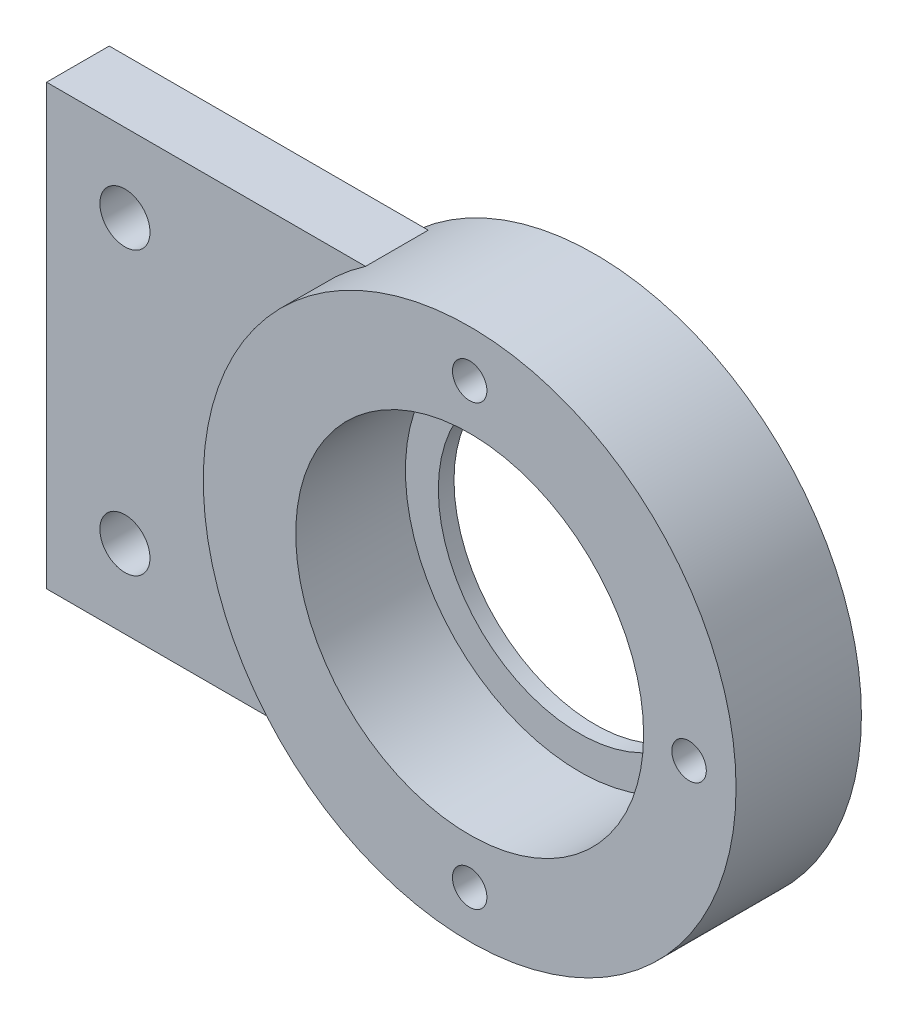
ISO-10303-21;
HEADER;
FILE_DESCRIPTION(('STEP AP214'),'2;1');
FILE_NAME('part.step','',(''),(''),'','','');
FILE_SCHEMA(('AUTOMOTIVE_DESIGN { 1 0 10303 214 1 1 1 1 }'));
ENDSEC;
DATA;
#1=APPLICATION_CONTEXT('core data for automotive mechanical design processes');
#2=APPLICATION_PROTOCOL_DEFINITION('international standard','automotive_design',2000,#1);
#3=PRODUCT_CONTEXT('',#1,'mechanical');
#4=PRODUCT('Part','Part','',(#3));
#5=PRODUCT_RELATED_PRODUCT_CATEGORY('part','',(#4));
#6=PRODUCT_DEFINITION_FORMATION('','',#4);
#7=PRODUCT_DEFINITION_CONTEXT('part definition',#1,'design');
#8=PRODUCT_DEFINITION('design','',#6,#7);
#9=PRODUCT_DEFINITION_SHAPE('','',#8);
#10=(LENGTH_UNIT() NAMED_UNIT(*) SI_UNIT(.MILLI.,.METRE.));
#11=(NAMED_UNIT(*) PLANE_ANGLE_UNIT() SI_UNIT($,.RADIAN.));
#12=(NAMED_UNIT(*) SI_UNIT($,.STERADIAN.) SOLID_ANGLE_UNIT());
#13=UNCERTAINTY_MEASURE_WITH_UNIT(LENGTH_MEASURE(1.E-05),#10,'distance_accuracy_value','');
#14=(GEOMETRIC_REPRESENTATION_CONTEXT(3) GLOBAL_UNCERTAINTY_ASSIGNED_CONTEXT((#13)) GLOBAL_UNIT_ASSIGNED_CONTEXT((#10,
#11,#12)) REPRESENTATION_CONTEXT('',''));
#15=CARTESIAN_POINT('',(0.,0.,0.));
#16=DIRECTION('',(0.,0.,1.));
#17=DIRECTION('',(1.,0.,0.));
#18=AXIS2_PLACEMENT_3D('',#15,#16,#17);
#19=CARTESIAN_POINT('',(0.,0.,0.));
#20=DIRECTION('',(0.,0.,1.));
#21=DIRECTION('',(1.,0.,0.));
#22=AXIS2_PLACEMENT_3D('',#19,#20,#21);
#23=PLANE('',#22);
#24=CARTESIAN_POINT('',(-25.,-9.,0.));
#25=DIRECTION('',(0.,0.,1.));
#26=DIRECTION('',(1.,0.,0.));
#27=AXIS2_PLACEMENT_3D('',#24,#25,#26);
#28=CIRCLE('',#27,1.6);
#29=CARTESIAN_POINT('',(-26.6,-9.,0.));
#30=VERTEX_POINT('',#29);
#31=EDGE_CURVE('E141',#30,#30,#28,.F.);
#32=ORIENTED_EDGE('',*,*,#31,.F.);
#33=EDGE_LOOP('',(#32));
#34=FACE_BOUND('',#33,.T.);
#35=CARTESIAN_POINT('',(-25.,9.,0.));
#36=DIRECTION('',(0.,0.,1.));
#37=DIRECTION('',(1.,0.,0.));
#38=AXIS2_PLACEMENT_3D('',#35,#36,#37);
#39=CIRCLE('',#38,1.6);
#40=CARTESIAN_POINT('',(-26.6,9.,0.));
#41=VERTEX_POINT('',#40);
#42=EDGE_CURVE('E136',#41,#41,#39,.F.);
#43=ORIENTED_EDGE('',*,*,#42,.F.);
#44=EDGE_LOOP('',(#43));
#45=FACE_BOUND('',#44,.T.);
#46=DIRECTION('',(-1.,0.,0.));
#47=VECTOR('',#46,1.);
#48=CARTESIAN_POINT('',(-30.,14.,0.));
#49=LINE('',#48,#47);
#50=CARTESIAN_POINT('',(-9.64365076099296,14.,0.));
#51=VERTEX_POINT('',#50);
#52=CARTESIAN_POINT('',(-30.,14.,0.));
#53=VERTEX_POINT('',#52);
#54=EDGE_CURVE('E89',#51,#53,#49,.T.);
#55=ORIENTED_EDGE('',*,*,#54,.F.);
#56=CARTESIAN_POINT('',(0.,0.,0.));
#57=DIRECTION('',(0.,0.,1.));
#58=DIRECTION('',(1.,0.,0.));
#59=AXIS2_PLACEMENT_3D('',#56,#57,#58);
#60=CIRCLE('',#59,17.);
#61=CARTESIAN_POINT('',(-9.64365076099296,-14.,0.));
#62=VERTEX_POINT('',#61);
#63=EDGE_CURVE('E70',#51,#62,#60,.T.);
#64=ORIENTED_EDGE('',*,*,#63,.T.);
#65=DIRECTION('',(1.,0.,0.));
#66=VECTOR('',#65,1.);
#67=CARTESIAN_POINT('',(-30.,-14.,0.));
#68=LINE('',#67,#66);
#69=CARTESIAN_POINT('',(-30.,-14.,0.));
#70=VERTEX_POINT('',#69);
#71=EDGE_CURVE('E86',#70,#62,#68,.T.);
#72=ORIENTED_EDGE('',*,*,#71,.F.);
#73=DIRECTION('',(0.,-1.,0.));
#74=VECTOR('',#73,1.);
#75=CARTESIAN_POINT('',(-30.,-14.,0.));
#76=LINE('',#75,#74);
#77=EDGE_CURVE('E95',#53,#70,#76,.T.);
#78=ORIENTED_EDGE('',*,*,#77,.F.);
#79=EDGE_LOOP('',(#55,#64,#72,#78));
#80=FACE_BOUND('',#79,.T.);
#81=ADVANCED_FACE('F44',(#34,#45,#80),#23,.F.);
#82=CARTESIAN_POINT('',(0.,0.,7.));
#83=DIRECTION('',(0.,0.,-1.));
#84=DIRECTION('',(-1.,0.,0.));
#85=AXIS2_PLACEMENT_3D('',#82,#83,#84);
#86=CYLINDRICAL_SURFACE('',#85,17.);
#87=CARTESIAN_POINT('',(0.,0.,7.));
#88=DIRECTION('',(0.,0.,1.));
#89=DIRECTION('',(1.,0.,0.));
#90=AXIS2_PLACEMENT_3D('',#87,#88,#89);
#91=CIRCLE('',#90,17.);
#92=CARTESIAN_POINT('',(17.,0.,7.));
#93=VERTEX_POINT('',#92);
#94=EDGE_CURVE('E122',#93,#93,#91,.T.);
#95=ORIENTED_EDGE('',*,*,#94,.F.);
#96=EDGE_LOOP('',(#95));
#97=FACE_BOUND('',#96,.T.);
#98=DIRECTION('',(0.,0.,-1.));
#99=VECTOR('',#98,1.);
#100=CARTESIAN_POINT('',(-9.64365076099296,-14.,7.));
#101=LINE('',#100,#99);
#102=CARTESIAN_POINT('',(-9.64365076099296,-14.,4.));
#103=VERTEX_POINT('',#102);
#104=EDGE_CURVE('E11',#62,#103,#101,.F.);
#105=ORIENTED_EDGE('',*,*,#104,.F.);
#106=ORIENTED_EDGE('',*,*,#63,.F.);
#107=DIRECTION('',(0.,0.,-1.));
#108=VECTOR('',#107,1.);
#109=CARTESIAN_POINT('',(-9.64365076099296,14.,7.));
#110=LINE('',#109,#108);
#111=CARTESIAN_POINT('',(-9.64365076099296,14.,4.));
#112=VERTEX_POINT('',#111);
#113=EDGE_CURVE('E54',#112,#51,#110,.T.);
#114=ORIENTED_EDGE('',*,*,#113,.F.);
#115=CARTESIAN_POINT('',(0.,0.,4.));
#116=DIRECTION('',(0.,0.,-1.));
#117=DIRECTION('',(-1.,0.,0.));
#118=AXIS2_PLACEMENT_3D('',#115,#116,#117);
#119=CIRCLE('',#118,17.);
#120=EDGE_CURVE('E63',#103,#112,#119,.T.);
#121=ORIENTED_EDGE('',*,*,#120,.F.);
#122=EDGE_LOOP('',(#105,#106,#114,#121));
#123=FACE_BOUND('',#122,.T.);
#124=CARTESIAN_POINT('',(0.,0.,-1.));
#125=DIRECTION('',(0.,0.,1.));
#126=DIRECTION('',(1.,0.,0.));
#127=AXIS2_PLACEMENT_3D('',#124,#125,#126);
#128=CIRCLE('',#127,17.);
#129=CARTESIAN_POINT('',(17.,0.,-1.));
#130=VERTEX_POINT('',#129);
#131=EDGE_CURVE('E91',#130,#130,#128,.T.);
#132=ORIENTED_EDGE('',*,*,#131,.T.);
#133=EDGE_LOOP('',(#132));
#134=FACE_BOUND('',#133,.T.);
#135=ADVANCED_FACE('F50',(#97,#123,#134),#86,.T.);
#136=CARTESIAN_POINT('',(0.,0.,7.));
#137=DIRECTION('',(0.,0.,-1.));
#138=DIRECTION('',(-1.,0.,0.));
#139=AXIS2_PLACEMENT_3D('',#136,#137,#138);
#140=CYLINDRICAL_SURFACE('',#139,11.1);
#141=CARTESIAN_POINT('',(0.,0.,0.));
#142=DIRECTION('',(0.,0.,1.));
#143=DIRECTION('',(1.,0.,0.));
#144=AXIS2_PLACEMENT_3D('',#141,#142,#143);
#145=CIRCLE('',#144,11.1);
#146=CARTESIAN_POINT('',(11.1,0.,0.));
#147=VERTEX_POINT('',#146);
#148=EDGE_CURVE('E116',#147,#147,#145,.T.);
#149=ORIENTED_EDGE('',*,*,#148,.F.);
#150=EDGE_LOOP('',(#149));
#151=FACE_BOUND('',#150,.T.);
#152=CARTESIAN_POINT('',(0.,0.,7.));
#153=DIRECTION('',(0.,0.,1.));
#154=DIRECTION('',(1.,0.,0.));
#155=AXIS2_PLACEMENT_3D('',#152,#153,#154);
#156=CIRCLE('',#155,11.1);
#157=CARTESIAN_POINT('',(11.1,0.,7.));
#158=VERTEX_POINT('',#157);
#159=EDGE_CURVE('E123',#158,#158,#156,.T.);
#160=ORIENTED_EDGE('',*,*,#159,.T.);
#161=EDGE_LOOP('',(#160));
#162=FACE_BOUND('',#161,.T.);
#163=ADVANCED_FACE('F219',(#151,#162),#140,.F.);
#164=CARTESIAN_POINT('',(0.,0.,7.));
#165=DIRECTION('',(0.,0.,1.));
#166=DIRECTION('',(1.,0.,0.));
#167=AXIS2_PLACEMENT_3D('',#164,#165,#166);
#168=PLANE('',#167);
#169=CARTESIAN_POINT('',(14.,0.,7.));
#170=DIRECTION('',(0.,0.,1.));
#171=DIRECTION('',(1.,0.,0.));
#172=AXIS2_PLACEMENT_3D('',#169,#170,#171);
#173=CIRCLE('',#172,1.1);
#174=CARTESIAN_POINT('',(12.9,0.,7.));
#175=VERTEX_POINT('',#174);
#176=EDGE_CURVE('E146',#175,#175,#173,.T.);
#177=ORIENTED_EDGE('',*,*,#176,.F.);
#178=EDGE_LOOP('',(#177));
#179=FACE_BOUND('',#178,.T.);
#180=CARTESIAN_POINT('',(0.,-14.,7.));
#181=DIRECTION('',(0.,0.,1.));
#182=DIRECTION('',(1.,0.,0.));
#183=AXIS2_PLACEMENT_3D('',#180,#181,#182);
#184=CIRCLE('',#183,1.1);
#185=CARTESIAN_POINT('',(-1.1,-14.,7.));
#186=VERTEX_POINT('',#185);
#187=EDGE_CURVE('E328',#186,#186,#184,.T.);
#188=ORIENTED_EDGE('',*,*,#187,.F.);
#189=EDGE_LOOP('',(#188));
#190=FACE_BOUND('',#189,.T.);
#191=CARTESIAN_POINT('',(0.,14.,7.));
#192=DIRECTION('',(0.,0.,1.));
#193=DIRECTION('',(1.,0.,0.));
#194=AXIS2_PLACEMENT_3D('',#191,#192,#193);
#195=CIRCLE('',#194,1.1);
#196=CARTESIAN_POINT('',(-1.1,14.,7.));
#197=VERTEX_POINT('',#196);
#198=EDGE_CURVE('E334',#197,#197,#195,.T.);
#199=ORIENTED_EDGE('',*,*,#198,.F.);
#200=EDGE_LOOP('',(#199));
#201=FACE_BOUND('',#200,.T.);
#202=ORIENTED_EDGE('',*,*,#94,.T.);
#203=EDGE_LOOP('',(#202));
#204=FACE_BOUND('',#203,.T.);
#205=ORIENTED_EDGE('',*,*,#159,.F.);
#206=EDGE_LOOP('',(#205));
#207=FACE_BOUND('',#206,.T.);
#208=ADVANCED_FACE('F223',(#179,#190,#201,#204,#207),#168,.T.);
#209=CARTESIAN_POINT('',(-30.,-14.,4.));
#210=DIRECTION('',(0.,1.,0.));
#211=DIRECTION('',(0.,0.,1.));
#212=AXIS2_PLACEMENT_3D('',#209,#210,#211);
#213=PLANE('',#212);
#214=ORIENTED_EDGE('',*,*,#71,.T.);
#215=ORIENTED_EDGE('',*,*,#104,.T.);
#216=DIRECTION('',(1.,0.,0.));
#217=VECTOR('',#216,1.);
#218=CARTESIAN_POINT('',(-30.,-14.,4.));
#219=LINE('',#218,#217);
#220=CARTESIAN_POINT('',(-30.,-14.,4.));
#221=VERTEX_POINT('',#220);
#222=EDGE_CURVE('E186',#221,#103,#219,.T.);
#223=ORIENTED_EDGE('',*,*,#222,.F.);
#224=DIRECTION('',(0.,0.,-1.));
#225=VECTOR('',#224,1.);
#226=CARTESIAN_POINT('',(-30.,-14.,4.));
#227=LINE('',#226,#225);
#228=EDGE_CURVE('E99',#221,#70,#227,.T.);
#229=ORIENTED_EDGE('',*,*,#228,.T.);
#230=EDGE_LOOP('',(#214,#215,#223,#229));
#231=FACE_BOUND('',#230,.T.);
#232=ADVANCED_FACE('F98',(#231),#213,.F.);
#233=CARTESIAN_POINT('',(-30.,14.,4.));
#234=DIRECTION('',(0.,-1.,0.));
#235=DIRECTION('',(0.,0.,-1.));
#236=AXIS2_PLACEMENT_3D('',#233,#234,#235);
#237=PLANE('',#236);
#238=DIRECTION('',(-1.,0.,0.));
#239=VECTOR('',#238,1.);
#240=CARTESIAN_POINT('',(-30.,14.,4.));
#241=LINE('',#240,#239);
#242=CARTESIAN_POINT('',(-30.,14.,4.));
#243=VERTEX_POINT('',#242);
#244=EDGE_CURVE('E113',#112,#243,#241,.T.);
#245=ORIENTED_EDGE('',*,*,#244,.F.);
#246=ORIENTED_EDGE('',*,*,#113,.T.);
#247=ORIENTED_EDGE('',*,*,#54,.T.);
#248=DIRECTION('',(0.,0.,-1.));
#249=VECTOR('',#248,1.);
#250=CARTESIAN_POINT('',(-30.,14.,4.));
#251=LINE('',#250,#249);
#252=EDGE_CURVE('E112',#243,#53,#251,.T.);
#253=ORIENTED_EDGE('',*,*,#252,.F.);
#254=EDGE_LOOP('',(#245,#246,#247,#253));
#255=FACE_BOUND('',#254,.T.);
#256=ADVANCED_FACE('F200',(#255),#237,.F.);
#257=CARTESIAN_POINT('',(-30.,-14.,4.));
#258=DIRECTION('',(1.,0.,0.));
#259=DIRECTION('',(0.,0.,-1.));
#260=AXIS2_PLACEMENT_3D('',#257,#258,#259);
#261=PLANE('',#260);
#262=ORIENTED_EDGE('',*,*,#77,.T.);
#263=ORIENTED_EDGE('',*,*,#228,.F.);
#264=DIRECTION('',(0.,-1.,0.));
#265=VECTOR('',#264,1.);
#266=CARTESIAN_POINT('',(-30.,-14.,4.));
#267=LINE('',#266,#265);
#268=EDGE_CURVE('E106',#243,#221,#267,.T.);
#269=ORIENTED_EDGE('',*,*,#268,.F.);
#270=ORIENTED_EDGE('',*,*,#252,.T.);
#271=EDGE_LOOP('',(#262,#263,#269,#270));
#272=FACE_BOUND('',#271,.T.);
#273=ADVANCED_FACE('F203',(#272),#261,.F.);
#274=CARTESIAN_POINT('',(0.,0.,4.));
#275=DIRECTION('',(0.,0.,-1.));
#276=DIRECTION('',(-1.,0.,0.));
#277=AXIS2_PLACEMENT_3D('',#274,#275,#276);
#278=PLANE('',#277);
#279=CARTESIAN_POINT('',(-25.,-9.,4.));
#280=DIRECTION('',(0.,0.,-1.));
#281=DIRECTION('',(-1.,0.,0.));
#282=AXIS2_PLACEMENT_3D('',#279,#280,#281);
#283=CIRCLE('',#282,1.6);
#284=CARTESIAN_POINT('',(-26.6,-9.,4.));
#285=VERTEX_POINT('',#284);
#286=EDGE_CURVE('E139',#285,#285,#283,.F.);
#287=ORIENTED_EDGE('',*,*,#286,.F.);
#288=EDGE_LOOP('',(#287));
#289=FACE_BOUND('',#288,.T.);
#290=CARTESIAN_POINT('',(-25.,9.,4.));
#291=DIRECTION('',(0.,0.,-1.));
#292=DIRECTION('',(-1.,0.,0.));
#293=AXIS2_PLACEMENT_3D('',#290,#291,#292);
#294=CIRCLE('',#293,1.6);
#295=CARTESIAN_POINT('',(-26.6,9.,4.));
#296=VERTEX_POINT('',#295);
#297=EDGE_CURVE('E134',#296,#296,#294,.F.);
#298=ORIENTED_EDGE('',*,*,#297,.F.);
#299=EDGE_LOOP('',(#298));
#300=FACE_BOUND('',#299,.T.);
#301=ORIENTED_EDGE('',*,*,#222,.T.);
#302=ORIENTED_EDGE('',*,*,#120,.T.);
#303=ORIENTED_EDGE('',*,*,#244,.T.);
#304=ORIENTED_EDGE('',*,*,#268,.T.);
#305=EDGE_LOOP('',(#301,#302,#303,#304));
#306=FACE_BOUND('',#305,.T.);
#307=ADVANCED_FACE('F198',(#289,#300,#306),#278,.F.);
#308=CARTESIAN_POINT('',(0.,0.,0.));
#309=DIRECTION('',(0.,0.,1.));
#310=DIRECTION('',(1.,0.,0.));
#311=AXIS2_PLACEMENT_3D('',#308,#309,#310);
#312=PLANE('',#311);
#313=ORIENTED_EDGE('',*,*,#148,.T.);
#314=EDGE_LOOP('',(#313));
#315=FACE_BOUND('',#314,.T.);
#316=CARTESIAN_POINT('',(0.,0.,0.));
#317=DIRECTION('',(0.,0.,1.));
#318=DIRECTION('',(1.,0.,0.));
#319=AXIS2_PLACEMENT_3D('',#316,#317,#318);
#320=CIRCLE('',#319,9.);
#321=CARTESIAN_POINT('',(9.,0.,0.));
#322=VERTEX_POINT('',#321);
#323=EDGE_CURVE('E178',#322,#322,#320,.T.);
#324=ORIENTED_EDGE('',*,*,#323,.F.);
#325=EDGE_LOOP('',(#324));
#326=FACE_BOUND('',#325,.T.);
#327=ADVANCED_FACE('F162',(#315,#326),#312,.T.);
#328=CARTESIAN_POINT('',(0.,0.,-1.));
#329=DIRECTION('',(0.,0.,1.));
#330=DIRECTION('',(1.,0.,0.));
#331=AXIS2_PLACEMENT_3D('',#328,#329,#330);
#332=PLANE('',#331);
#333=CARTESIAN_POINT('',(14.,0.,-1.));
#334=DIRECTION('',(0.,0.,1.));
#335=DIRECTION('',(1.,0.,0.));
#336=AXIS2_PLACEMENT_3D('',#333,#334,#335);
#337=CIRCLE('',#336,1.1);
#338=CARTESIAN_POINT('',(12.9,0.,-1.));
#339=VERTEX_POINT('',#338);
#340=EDGE_CURVE('E47',#339,#339,#337,.F.);
#341=ORIENTED_EDGE('',*,*,#340,.F.);
#342=EDGE_LOOP('',(#341));
#343=FACE_BOUND('',#342,.T.);
#344=CARTESIAN_POINT('',(0.,-14.,-1.));
#345=DIRECTION('',(0.,0.,1.));
#346=DIRECTION('',(1.,0.,0.));
#347=AXIS2_PLACEMENT_3D('',#344,#345,#346);
#348=CIRCLE('',#347,1.1);
#349=CARTESIAN_POINT('',(-1.1,-14.,-1.));
#350=VERTEX_POINT('',#349);
#351=EDGE_CURVE('E150',#350,#350,#348,.F.);
#352=ORIENTED_EDGE('',*,*,#351,.F.);
#353=EDGE_LOOP('',(#352));
#354=FACE_BOUND('',#353,.T.);
#355=CARTESIAN_POINT('',(0.,14.,-1.));
#356=DIRECTION('',(0.,0.,1.));
#357=DIRECTION('',(1.,0.,0.));
#358=AXIS2_PLACEMENT_3D('',#355,#356,#357);
#359=CIRCLE('',#358,1.1);
#360=CARTESIAN_POINT('',(-1.1,14.,-1.));
#361=VERTEX_POINT('',#360);
#362=EDGE_CURVE('E145',#361,#361,#359,.F.);
#363=ORIENTED_EDGE('',*,*,#362,.F.);
#364=EDGE_LOOP('',(#363));
#365=FACE_BOUND('',#364,.T.);
#366=ORIENTED_EDGE('',*,*,#131,.F.);
#367=EDGE_LOOP('',(#366));
#368=FACE_BOUND('',#367,.T.);
#369=CARTESIAN_POINT('',(0.,0.,-1.));
#370=DIRECTION('',(0.,0.,1.));
#371=DIRECTION('',(1.,0.,0.));
#372=AXIS2_PLACEMENT_3D('',#369,#370,#371);
#373=CIRCLE('',#372,9.);
#374=CARTESIAN_POINT('',(9.,0.,-1.));
#375=VERTEX_POINT('',#374);
#376=EDGE_CURVE('E173',#375,#375,#373,.T.);
#377=ORIENTED_EDGE('',*,*,#376,.T.);
#378=EDGE_LOOP('',(#377));
#379=FACE_BOUND('',#378,.T.);
#380=ADVANCED_FACE('F157',(#343,#354,#365,#368,#379),#332,.F.);
#381=CARTESIAN_POINT('',(0.,0.,0.));
#382=DIRECTION('',(0.,0.,-1.));
#383=DIRECTION('',(-1.,0.,0.));
#384=AXIS2_PLACEMENT_3D('',#381,#382,#383);
#385=CYLINDRICAL_SURFACE('',#384,9.);
#386=ORIENTED_EDGE('',*,*,#323,.T.);
#387=EDGE_LOOP('',(#386));
#388=FACE_BOUND('',#387,.T.);
#389=ORIENTED_EDGE('',*,*,#376,.F.);
#390=EDGE_LOOP('',(#389));
#391=FACE_BOUND('',#390,.T.);
#392=ADVANCED_FACE('F165',(#388,#391),#385,.F.);
#393=CARTESIAN_POINT('',(-25.,9.,7.));
#394=DIRECTION('',(0.,0.,-1.));
#395=DIRECTION('',(-1.,0.,0.));
#396=AXIS2_PLACEMENT_3D('',#393,#394,#395);
#397=CYLINDRICAL_SURFACE('',#396,1.6);
#398=CARTESIAN_POINT('',(-26.6,9.,4.));
#399=CARTESIAN_POINT('',(-26.6,9.,3.95833333333333));
#400=CARTESIAN_POINT('',(-26.6,9.,3.91666666666667));
#401=CARTESIAN_POINT('',(-26.6,9.,3.83333333333333));
#402=CARTESIAN_POINT('',(-26.6,9.,3.79166666666667));
#403=CARTESIAN_POINT('',(-26.6,9.,3.70833333333333));
#404=CARTESIAN_POINT('',(-26.6,9.,3.66666666666667));
#405=CARTESIAN_POINT('',(-26.6,9.,3.58333333333333));
#406=CARTESIAN_POINT('',(-26.6,9.,3.54166666666667));
#407=CARTESIAN_POINT('',(-26.6,9.,3.45833333333333));
#408=CARTESIAN_POINT('',(-26.6,9.,3.41666666666667));
#409=CARTESIAN_POINT('',(-26.6,9.,3.33333333333333));
#410=CARTESIAN_POINT('',(-26.6,9.,3.29166666666667));
#411=CARTESIAN_POINT('',(-26.6,9.,3.20833333333333));
#412=CARTESIAN_POINT('',(-26.6,9.,3.16666666666667));
#413=CARTESIAN_POINT('',(-26.6,9.,3.08333333333333));
#414=CARTESIAN_POINT('',(-26.6,9.,3.04166666666667));
#415=CARTESIAN_POINT('',(-26.6,9.,2.95833333333333));
#416=CARTESIAN_POINT('',(-26.6,9.,2.91666666666667));
#417=CARTESIAN_POINT('',(-26.6,9.,2.83333333333333));
#418=CARTESIAN_POINT('',(-26.6,9.,2.79166666666667));
#419=CARTESIAN_POINT('',(-26.6,9.,2.70833333333333));
#420=CARTESIAN_POINT('',(-26.6,9.,2.66666666666667));
#421=CARTESIAN_POINT('',(-26.6,9.,2.58333333333333));
#422=CARTESIAN_POINT('',(-26.6,9.,2.54166666666667));
#423=CARTESIAN_POINT('',(-26.6,9.,2.45833333333333));
#424=CARTESIAN_POINT('',(-26.6,9.,2.41666666666667));
#425=CARTESIAN_POINT('',(-26.6,9.,2.33333333333333));
#426=CARTESIAN_POINT('',(-26.6,9.,2.29166666666667));
#427=CARTESIAN_POINT('',(-26.6,9.,2.20833333333333));
#428=CARTESIAN_POINT('',(-26.6,9.,2.16666666666667));
#429=CARTESIAN_POINT('',(-26.6,9.,2.08333333333333));
#430=CARTESIAN_POINT('',(-26.6,9.,2.04166666666667));
#431=CARTESIAN_POINT('',(-26.6,9.,1.95833333333333));
#432=CARTESIAN_POINT('',(-26.6,9.,1.91666666666667));
#433=CARTESIAN_POINT('',(-26.6,9.,1.83333333333333));
#434=CARTESIAN_POINT('',(-26.6,9.,1.79166666666667));
#435=CARTESIAN_POINT('',(-26.6,9.,1.70833333333333));
#436=CARTESIAN_POINT('',(-26.6,9.,1.66666666666667));
#437=CARTESIAN_POINT('',(-26.6,9.,1.58333333333333));
#438=CARTESIAN_POINT('',(-26.6,9.,1.54166666666667));
#439=CARTESIAN_POINT('',(-26.6,9.,1.45833333333333));
#440=CARTESIAN_POINT('',(-26.6,9.,1.41666666666667));
#441=CARTESIAN_POINT('',(-26.6,9.,1.33333333333333));
#442=CARTESIAN_POINT('',(-26.6,9.,1.29166666666667));
#443=CARTESIAN_POINT('',(-26.6,9.,1.20833333333333));
#444=CARTESIAN_POINT('',(-26.6,9.,1.16666666666667));
#445=CARTESIAN_POINT('',(-26.6,9.,1.08333333333333));
#446=CARTESIAN_POINT('',(-26.6,9.,1.04166666666667));
#447=CARTESIAN_POINT('',(-26.6,9.,0.958333333333333));
#448=CARTESIAN_POINT('',(-26.6,9.,0.916666666666667));
#449=CARTESIAN_POINT('',(-26.6,9.,0.833333333333333));
#450=CARTESIAN_POINT('',(-26.6,9.,0.791666666666667));
#451=CARTESIAN_POINT('',(-26.6,9.,0.708333333333333));
#452=CARTESIAN_POINT('',(-26.6,9.,0.666666666666666));
#453=CARTESIAN_POINT('',(-26.6,9.,0.583333333333333));
#454=CARTESIAN_POINT('',(-26.6,9.,0.541666666666666));
#455=CARTESIAN_POINT('',(-26.6,9.,0.458333333333333));
#456=CARTESIAN_POINT('',(-26.6,9.,0.416666666666666));
#457=CARTESIAN_POINT('',(-26.6,9.,0.333333333333333));
#458=CARTESIAN_POINT('',(-26.6,9.,0.291666666666666));
#459=CARTESIAN_POINT('',(-26.6,9.,0.208333333333333));
#460=CARTESIAN_POINT('',(-26.6,9.,0.166666666666666));
#461=CARTESIAN_POINT('',(-26.6,9.,0.0833333333333325));
#462=CARTESIAN_POINT('',(-26.6,9.,0.0416666666666658));
#463=CARTESIAN_POINT('',(-26.6,9.,0.));
#464=B_SPLINE_CURVE_WITH_KNOTS('',3,(#398,#399,#400,#401,#402,#403,#404,#405,#406,#407,#408,
#409,#410,#411,#412,#413,#414,#415,#416,#417,#418,#419,#420,#421,#422,#423,#424,#425,#426,#427,
#428,#429,#430,#431,#432,#433,#434,#435,#436,#437,#438,#439,#440,#441,#442,#443,#444,#445,#446,
#447,#448,#449,#450,#451,#452,#453,#454,#455,#456,#457,#458,#459,#460,#461,#462,#463),
.UNSPECIFIED.,.F.,.F.,(4,2,2,2,2,2,2,2,2,2,2,2,2,2,2,2,2,2,2,2,2,2,2,2,2,2,2,2,2,2,2,2,4),(0.,
0.125,0.25,0.375,0.5,0.625,0.75,0.875,1.,1.125,1.25,1.375,1.5,1.625,1.75,1.875,2.,2.125,2.25,
2.375,2.5,2.625,2.75,2.875,3.,3.125,3.25,3.375,3.5,3.625,3.75,3.875,4.),.UNSPECIFIED.);
#465=EDGE_CURVE('BSEAM242',#296,#41,#464,.T.);
#466=ORIENTED_EDGE('',*,*,#297,.T.);
#467=ORIENTED_EDGE('',*,*,#42,.T.);
#468=ORIENTED_EDGE('',*,*,#465,.T.);
#469=ORIENTED_EDGE('',*,*,#465,.F.);
#470=EDGE_LOOP('',(#466,#468,#467,#469));
#471=FACE_BOUND('',#470,.T.);
#472=ADVANCED_FACE('F242',(#471),#397,.F.);
#473=CARTESIAN_POINT('',(-25.,-9.,7.));
#474=DIRECTION('',(0.,0.,-1.));
#475=DIRECTION('',(-1.,0.,0.));
#476=AXIS2_PLACEMENT_3D('',#473,#474,#475);
#477=CYLINDRICAL_SURFACE('',#476,1.6);
#478=CARTESIAN_POINT('',(-26.6,-9.,4.));
#479=CARTESIAN_POINT('',(-26.6,-9.,3.95833333333333));
#480=CARTESIAN_POINT('',(-26.6,-9.,3.91666666666667));
#481=CARTESIAN_POINT('',(-26.6,-9.,3.83333333333333));
#482=CARTESIAN_POINT('',(-26.6,-9.,3.79166666666667));
#483=CARTESIAN_POINT('',(-26.6,-9.,3.70833333333333));
#484=CARTESIAN_POINT('',(-26.6,-9.,3.66666666666667));
#485=CARTESIAN_POINT('',(-26.6,-9.,3.58333333333333));
#486=CARTESIAN_POINT('',(-26.6,-9.,3.54166666666667));
#487=CARTESIAN_POINT('',(-26.6,-9.,3.45833333333333));
#488=CARTESIAN_POINT('',(-26.6,-9.,3.41666666666667));
#489=CARTESIAN_POINT('',(-26.6,-9.,3.33333333333333));
#490=CARTESIAN_POINT('',(-26.6,-9.,3.29166666666667));
#491=CARTESIAN_POINT('',(-26.6,-9.,3.20833333333333));
#492=CARTESIAN_POINT('',(-26.6,-9.,3.16666666666667));
#493=CARTESIAN_POINT('',(-26.6,-9.,3.08333333333333));
#494=CARTESIAN_POINT('',(-26.6,-9.,3.04166666666667));
#495=CARTESIAN_POINT('',(-26.6,-9.,2.95833333333333));
#496=CARTESIAN_POINT('',(-26.6,-9.,2.91666666666667));
#497=CARTESIAN_POINT('',(-26.6,-9.,2.83333333333333));
#498=CARTESIAN_POINT('',(-26.6,-9.,2.79166666666667));
#499=CARTESIAN_POINT('',(-26.6,-9.,2.70833333333333));
#500=CARTESIAN_POINT('',(-26.6,-9.,2.66666666666667));
#501=CARTESIAN_POINT('',(-26.6,-9.,2.58333333333333));
#502=CARTESIAN_POINT('',(-26.6,-9.,2.54166666666667));
#503=CARTESIAN_POINT('',(-26.6,-9.,2.45833333333333));
#504=CARTESIAN_POINT('',(-26.6,-9.,2.41666666666667));
#505=CARTESIAN_POINT('',(-26.6,-9.,2.33333333333333));
#506=CARTESIAN_POINT('',(-26.6,-9.,2.29166666666667));
#507=CARTESIAN_POINT('',(-26.6,-9.,2.20833333333333));
#508=CARTESIAN_POINT('',(-26.6,-9.,2.16666666666667));
#509=CARTESIAN_POINT('',(-26.6,-9.,2.08333333333333));
#510=CARTESIAN_POINT('',(-26.6,-9.,2.04166666666667));
#511=CARTESIAN_POINT('',(-26.6,-9.,1.95833333333333));
#512=CARTESIAN_POINT('',(-26.6,-9.,1.91666666666667));
#513=CARTESIAN_POINT('',(-26.6,-9.,1.83333333333333));
#514=CARTESIAN_POINT('',(-26.6,-9.,1.79166666666667));
#515=CARTESIAN_POINT('',(-26.6,-9.,1.70833333333333));
#516=CARTESIAN_POINT('',(-26.6,-9.,1.66666666666667));
#517=CARTESIAN_POINT('',(-26.6,-9.,1.58333333333333));
#518=CARTESIAN_POINT('',(-26.6,-9.,1.54166666666667));
#519=CARTESIAN_POINT('',(-26.6,-9.,1.45833333333333));
#520=CARTESIAN_POINT('',(-26.6,-9.,1.41666666666667));
#521=CARTESIAN_POINT('',(-26.6,-9.,1.33333333333333));
#522=CARTESIAN_POINT('',(-26.6,-9.,1.29166666666667));
#523=CARTESIAN_POINT('',(-26.6,-9.,1.20833333333333));
#524=CARTESIAN_POINT('',(-26.6,-9.,1.16666666666667));
#525=CARTESIAN_POINT('',(-26.6,-9.,1.08333333333333));
#526=CARTESIAN_POINT('',(-26.6,-9.,1.04166666666667));
#527=CARTESIAN_POINT('',(-26.6,-9.,0.958333333333333));
#528=CARTESIAN_POINT('',(-26.6,-9.,0.916666666666667));
#529=CARTESIAN_POINT('',(-26.6,-9.,0.833333333333333));
#530=CARTESIAN_POINT('',(-26.6,-9.,0.791666666666667));
#531=CARTESIAN_POINT('',(-26.6,-9.,0.708333333333333));
#532=CARTESIAN_POINT('',(-26.6,-9.,0.666666666666666));
#533=CARTESIAN_POINT('',(-26.6,-9.,0.583333333333333));
#534=CARTESIAN_POINT('',(-26.6,-9.,0.541666666666666));
#535=CARTESIAN_POINT('',(-26.6,-9.,0.458333333333333));
#536=CARTESIAN_POINT('',(-26.6,-9.,0.416666666666666));
#537=CARTESIAN_POINT('',(-26.6,-9.,0.333333333333333));
#538=CARTESIAN_POINT('',(-26.6,-9.,0.291666666666666));
#539=CARTESIAN_POINT('',(-26.6,-9.,0.208333333333333));
#540=CARTESIAN_POINT('',(-26.6,-9.,0.166666666666666));
#541=CARTESIAN_POINT('',(-26.6,-9.,0.0833333333333325));
#542=CARTESIAN_POINT('',(-26.6,-9.,0.0416666666666658));
#543=CARTESIAN_POINT('',(-26.6,-9.,0.));
#544=B_SPLINE_CURVE_WITH_KNOTS('',3,(#478,#479,#480,#481,#482,#483,#484,#485,#486,#487,#488,
#489,#490,#491,#492,#493,#494,#495,#496,#497,#498,#499,#500,#501,#502,#503,#504,#505,#506,#507,
#508,#509,#510,#511,#512,#513,#514,#515,#516,#517,#518,#519,#520,#521,#522,#523,#524,#525,#526,
#527,#528,#529,#530,#531,#532,#533,#534,#535,#536,#537,#538,#539,#540,#541,#542,#543),
.UNSPECIFIED.,.F.,.F.,(4,2,2,2,2,2,2,2,2,2,2,2,2,2,2,2,2,2,2,2,2,2,2,2,2,2,2,2,2,2,2,2,4),(0.,
0.125,0.25,0.375,0.5,0.625,0.75,0.875,1.,1.125,1.25,1.375,1.5,1.625,1.75,1.875,2.,2.125,2.25,
2.375,2.5,2.625,2.75,2.875,3.,3.125,3.25,3.375,3.5,3.625,3.75,3.875,4.),.UNSPECIFIED.);
#545=EDGE_CURVE('BSEAM248',#285,#30,#544,.T.);
#546=ORIENTED_EDGE('',*,*,#286,.T.);
#547=ORIENTED_EDGE('',*,*,#31,.T.);
#548=ORIENTED_EDGE('',*,*,#545,.T.);
#549=ORIENTED_EDGE('',*,*,#545,.F.);
#550=EDGE_LOOP('',(#546,#548,#547,#549));
#551=FACE_BOUND('',#550,.T.);
#552=ADVANCED_FACE('F248',(#551),#477,.F.);
#553=CARTESIAN_POINT('',(0.,14.,7.));
#554=DIRECTION('',(0.,0.,-1.));
#555=DIRECTION('',(-1.,0.,0.));
#556=AXIS2_PLACEMENT_3D('',#553,#554,#555);
#557=CYLINDRICAL_SURFACE('',#556,1.1);
#558=CARTESIAN_POINT('',(-1.1,14.,7.));
#559=CARTESIAN_POINT('',(-1.1,14.,6.91666666666667));
#560=CARTESIAN_POINT('',(-1.1,14.,6.83333333333333));
#561=CARTESIAN_POINT('',(-1.1,14.,6.66666666666667));
#562=CARTESIAN_POINT('',(-1.1,14.,6.58333333333333));
#563=CARTESIAN_POINT('',(-1.1,14.,6.41666666666667));
#564=CARTESIAN_POINT('',(-1.1,14.,6.33333333333333));
#565=CARTESIAN_POINT('',(-1.1,14.,6.16666666666667));
#566=CARTESIAN_POINT('',(-1.1,14.,6.08333333333333));
#567=CARTESIAN_POINT('',(-1.1,14.,5.91666666666666));
#568=CARTESIAN_POINT('',(-1.1,14.,5.83333333333333));
#569=CARTESIAN_POINT('',(-1.1,14.,5.66666666666666));
#570=CARTESIAN_POINT('',(-1.1,14.,5.58333333333333));
#571=CARTESIAN_POINT('',(-1.1,14.,5.41666666666667));
#572=CARTESIAN_POINT('',(-1.1,14.,5.33333333333333));
#573=CARTESIAN_POINT('',(-1.1,14.,5.16666666666667));
#574=CARTESIAN_POINT('',(-1.1,14.,5.08333333333333));
#575=CARTESIAN_POINT('',(-1.1,14.,4.91666666666666));
#576=CARTESIAN_POINT('',(-1.1,14.,4.83333333333333));
#577=CARTESIAN_POINT('',(-1.1,14.,4.66666666666666));
#578=CARTESIAN_POINT('',(-1.1,14.,4.58333333333333));
#579=CARTESIAN_POINT('',(-1.1,14.,4.41666666666667));
#580=CARTESIAN_POINT('',(-1.1,14.,4.33333333333333));
#581=CARTESIAN_POINT('',(-1.1,14.,4.16666666666667));
#582=CARTESIAN_POINT('',(-1.1,14.,4.08333333333333));
#583=CARTESIAN_POINT('',(-1.1,14.,3.91666666666666));
#584=CARTESIAN_POINT('',(-1.1,14.,3.83333333333333));
#585=CARTESIAN_POINT('',(-1.1,14.,3.66666666666666));
#586=CARTESIAN_POINT('',(-1.1,14.,3.58333333333333));
#587=CARTESIAN_POINT('',(-1.1,14.,3.41666666666666));
#588=CARTESIAN_POINT('',(-1.1,14.,3.33333333333333));
#589=CARTESIAN_POINT('',(-1.1,14.,3.16666666666666));
#590=CARTESIAN_POINT('',(-1.1,14.,3.08333333333333));
#591=CARTESIAN_POINT('',(-1.1,14.,2.91666666666667));
#592=CARTESIAN_POINT('',(-1.1,14.,2.83333333333333));
#593=CARTESIAN_POINT('',(-1.1,14.,2.66666666666666));
#594=CARTESIAN_POINT('',(-1.1,14.,2.58333333333333));
#595=CARTESIAN_POINT('',(-1.1,14.,2.41666666666666));
#596=CARTESIAN_POINT('',(-1.1,14.,2.33333333333333));
#597=CARTESIAN_POINT('',(-1.1,14.,2.16666666666666));
#598=CARTESIAN_POINT('',(-1.1,14.,2.08333333333333));
#599=CARTESIAN_POINT('',(-1.1,14.,1.91666666666666));
#600=CARTESIAN_POINT('',(-1.1,14.,1.83333333333333));
#601=CARTESIAN_POINT('',(-1.1,14.,1.66666666666666));
#602=CARTESIAN_POINT('',(-1.1,14.,1.58333333333333));
#603=CARTESIAN_POINT('',(-1.1,14.,1.41666666666666));
#604=CARTESIAN_POINT('',(-1.1,14.,1.33333333333333));
#605=CARTESIAN_POINT('',(-1.1,14.,1.16666666666666));
#606=CARTESIAN_POINT('',(-1.1,14.,1.08333333333333));
#607=CARTESIAN_POINT('',(-1.1,14.,0.916666666666664));
#608=CARTESIAN_POINT('',(-1.1,14.,0.833333333333331));
#609=CARTESIAN_POINT('',(-1.1,14.,0.666666666666664));
#610=CARTESIAN_POINT('',(-1.1,14.,0.58333333333333));
#611=CARTESIAN_POINT('',(-1.1,14.,0.416666666666664));
#612=CARTESIAN_POINT('',(-1.1,14.,0.33333333333333));
#613=CARTESIAN_POINT('',(-1.1,14.,0.166666666666664));
#614=CARTESIAN_POINT('',(-1.1,14.,0.0833333333333305));
#615=CARTESIAN_POINT('',(-1.1,14.,-0.083333333333336));
#616=CARTESIAN_POINT('',(-1.1,14.,-0.166666666666669));
#617=CARTESIAN_POINT('',(-1.1,14.,-0.333333333333336));
#618=CARTESIAN_POINT('',(-1.1,14.,-0.41666666666667));
#619=CARTESIAN_POINT('',(-1.1,14.,-0.583333333333336));
#620=CARTESIAN_POINT('',(-1.1,14.,-0.66666666666667));
#621=CARTESIAN_POINT('',(-1.1,14.,-0.833333333333336));
#622=CARTESIAN_POINT('',(-1.1,14.,-0.91666666666667));
#623=CARTESIAN_POINT('',(-1.1,14.,-1.));
#624=B_SPLINE_CURVE_WITH_KNOTS('',3,(#558,#559,#560,#561,#562,#563,#564,#565,#566,#567,#568,
#569,#570,#571,#572,#573,#574,#575,#576,#577,#578,#579,#580,#581,#582,#583,#584,#585,#586,#587,
#588,#589,#590,#591,#592,#593,#594,#595,#596,#597,#598,#599,#600,#601,#602,#603,#604,#605,#606,
#607,#608,#609,#610,#611,#612,#613,#614,#615,#616,#617,#618,#619,#620,#621,#622,#623),
.UNSPECIFIED.,.F.,.F.,(4,2,2,2,2,2,2,2,2,2,2,2,2,2,2,2,2,2,2,2,2,2,2,2,2,2,2,2,2,2,2,2,4),(0.,
0.25,0.5,0.750000000000001,1.,1.25,1.5,1.75,2.,2.25,2.5,2.75,3.,3.25,3.5,3.75,4.,4.25,4.5,4.75,
5.,5.25,5.5,5.75,6.,6.25,6.5,6.75,7.,7.25,7.5,7.75,8.),.UNSPECIFIED.);
#625=EDGE_CURVE('BSEAM297',#197,#361,#624,.T.);
#626=ORIENTED_EDGE('',*,*,#198,.T.);
#627=ORIENTED_EDGE('',*,*,#362,.T.);
#628=ORIENTED_EDGE('',*,*,#625,.T.);
#629=ORIENTED_EDGE('',*,*,#625,.F.);
#630=EDGE_LOOP('',(#626,#628,#627,#629));
#631=FACE_BOUND('',#630,.T.);
#632=ADVANCED_FACE('F297',(#631),#557,.F.);
#633=CARTESIAN_POINT('',(0.,-14.,7.));
#634=DIRECTION('',(0.,0.,-1.));
#635=DIRECTION('',(-1.,0.,0.));
#636=AXIS2_PLACEMENT_3D('',#633,#634,#635);
#637=CYLINDRICAL_SURFACE('',#636,1.1);
#638=CARTESIAN_POINT('',(-1.1,-14.,7.));
#639=CARTESIAN_POINT('',(-1.1,-14.,6.91666666666667));
#640=CARTESIAN_POINT('',(-1.1,-14.,6.83333333333333));
#641=CARTESIAN_POINT('',(-1.1,-14.,6.66666666666667));
#642=CARTESIAN_POINT('',(-1.1,-14.,6.58333333333333));
#643=CARTESIAN_POINT('',(-1.1,-14.,6.41666666666667));
#644=CARTESIAN_POINT('',(-1.1,-14.,6.33333333333333));
#645=CARTESIAN_POINT('',(-1.1,-14.,6.16666666666667));
#646=CARTESIAN_POINT('',(-1.1,-14.,6.08333333333333));
#647=CARTESIAN_POINT('',(-1.1,-14.,5.91666666666666));
#648=CARTESIAN_POINT('',(-1.1,-14.,5.83333333333333));
#649=CARTESIAN_POINT('',(-1.1,-14.,5.66666666666666));
#650=CARTESIAN_POINT('',(-1.1,-14.,5.58333333333333));
#651=CARTESIAN_POINT('',(-1.1,-14.,5.41666666666667));
#652=CARTESIAN_POINT('',(-1.1,-14.,5.33333333333333));
#653=CARTESIAN_POINT('',(-1.1,-14.,5.16666666666667));
#654=CARTESIAN_POINT('',(-1.1,-14.,5.08333333333333));
#655=CARTESIAN_POINT('',(-1.1,-14.,4.91666666666666));
#656=CARTESIAN_POINT('',(-1.1,-14.,4.83333333333333));
#657=CARTESIAN_POINT('',(-1.1,-14.,4.66666666666666));
#658=CARTESIAN_POINT('',(-1.1,-14.,4.58333333333333));
#659=CARTESIAN_POINT('',(-1.1,-14.,4.41666666666667));
#660=CARTESIAN_POINT('',(-1.1,-14.,4.33333333333333));
#661=CARTESIAN_POINT('',(-1.1,-14.,4.16666666666667));
#662=CARTESIAN_POINT('',(-1.1,-14.,4.08333333333333));
#663=CARTESIAN_POINT('',(-1.1,-14.,3.91666666666666));
#664=CARTESIAN_POINT('',(-1.1,-14.,3.83333333333333));
#665=CARTESIAN_POINT('',(-1.1,-14.,3.66666666666666));
#666=CARTESIAN_POINT('',(-1.1,-14.,3.58333333333333));
#667=CARTESIAN_POINT('',(-1.1,-14.,3.41666666666666));
#668=CARTESIAN_POINT('',(-1.1,-14.,3.33333333333333));
#669=CARTESIAN_POINT('',(-1.1,-14.,3.16666666666666));
#670=CARTESIAN_POINT('',(-1.1,-14.,3.08333333333333));
#671=CARTESIAN_POINT('',(-1.1,-14.,2.91666666666667));
#672=CARTESIAN_POINT('',(-1.1,-14.,2.83333333333333));
#673=CARTESIAN_POINT('',(-1.1,-14.,2.66666666666666));
#674=CARTESIAN_POINT('',(-1.1,-14.,2.58333333333333));
#675=CARTESIAN_POINT('',(-1.1,-14.,2.41666666666666));
#676=CARTESIAN_POINT('',(-1.1,-14.,2.33333333333333));
#677=CARTESIAN_POINT('',(-1.1,-14.,2.16666666666666));
#678=CARTESIAN_POINT('',(-1.1,-14.,2.08333333333333));
#679=CARTESIAN_POINT('',(-1.1,-14.,1.91666666666666));
#680=CARTESIAN_POINT('',(-1.1,-14.,1.83333333333333));
#681=CARTESIAN_POINT('',(-1.1,-14.,1.66666666666666));
#682=CARTESIAN_POINT('',(-1.1,-14.,1.58333333333333));
#683=CARTESIAN_POINT('',(-1.1,-14.,1.41666666666666));
#684=CARTESIAN_POINT('',(-1.1,-14.,1.33333333333333));
#685=CARTESIAN_POINT('',(-1.1,-14.,1.16666666666666));
#686=CARTESIAN_POINT('',(-1.1,-14.,1.08333333333333));
#687=CARTESIAN_POINT('',(-1.1,-14.,0.916666666666664));
#688=CARTESIAN_POINT('',(-1.1,-14.,0.833333333333331));
#689=CARTESIAN_POINT('',(-1.1,-14.,0.666666666666664));
#690=CARTESIAN_POINT('',(-1.1,-14.,0.58333333333333));
#691=CARTESIAN_POINT('',(-1.1,-14.,0.416666666666664));
#692=CARTESIAN_POINT('',(-1.1,-14.,0.33333333333333));
#693=CARTESIAN_POINT('',(-1.1,-14.,0.166666666666664));
#694=CARTESIAN_POINT('',(-1.1,-14.,0.0833333333333305));
#695=CARTESIAN_POINT('',(-1.1,-14.,-0.083333333333336));
#696=CARTESIAN_POINT('',(-1.1,-14.,-0.166666666666669));
#697=CARTESIAN_POINT('',(-1.1,-14.,-0.333333333333336));
#698=CARTESIAN_POINT('',(-1.1,-14.,-0.41666666666667));
#699=CARTESIAN_POINT('',(-1.1,-14.,-0.583333333333336));
#700=CARTESIAN_POINT('',(-1.1,-14.,-0.66666666666667));
#701=CARTESIAN_POINT('',(-1.1,-14.,-0.833333333333336));
#702=CARTESIAN_POINT('',(-1.1,-14.,-0.91666666666667));
#703=CARTESIAN_POINT('',(-1.1,-14.,-1.));
#704=B_SPLINE_CURVE_WITH_KNOTS('',3,(#638,#639,#640,#641,#642,#643,#644,#645,#646,#647,#648,
#649,#650,#651,#652,#653,#654,#655,#656,#657,#658,#659,#660,#661,#662,#663,#664,#665,#666,#667,
#668,#669,#670,#671,#672,#673,#674,#675,#676,#677,#678,#679,#680,#681,#682,#683,#684,#685,#686,
#687,#688,#689,#690,#691,#692,#693,#694,#695,#696,#697,#698,#699,#700,#701,#702,#703),
.UNSPECIFIED.,.F.,.F.,(4,2,2,2,2,2,2,2,2,2,2,2,2,2,2,2,2,2,2,2,2,2,2,2,2,2,2,2,2,2,2,2,4),(0.,
0.25,0.5,0.750000000000001,1.,1.25,1.5,1.75,2.,2.25,2.5,2.75,3.,3.25,3.5,3.75,4.,4.25,4.5,4.75,
5.,5.25,5.5,5.75,6.,6.25,6.5,6.75,7.,7.25,7.5,7.75,8.),.UNSPECIFIED.);
#705=EDGE_CURVE('BSEAM304',#186,#350,#704,.T.);
#706=ORIENTED_EDGE('',*,*,#187,.T.);
#707=ORIENTED_EDGE('',*,*,#351,.T.);
#708=ORIENTED_EDGE('',*,*,#705,.T.);
#709=ORIENTED_EDGE('',*,*,#705,.F.);
#710=EDGE_LOOP('',(#706,#708,#707,#709));
#711=FACE_BOUND('',#710,.T.);
#712=ADVANCED_FACE('F304',(#711),#637,.F.);
#713=CARTESIAN_POINT('',(14.,0.,7.));
#714=DIRECTION('',(0.,0.,-1.));
#715=DIRECTION('',(-1.,0.,0.));
#716=AXIS2_PLACEMENT_3D('',#713,#714,#715);
#717=CYLINDRICAL_SURFACE('',#716,1.1);
#718=CARTESIAN_POINT('',(12.9,0.,7.));
#719=CARTESIAN_POINT('',(12.9,0.,6.91666666666667));
#720=CARTESIAN_POINT('',(12.9,0.,6.83333333333333));
#721=CARTESIAN_POINT('',(12.9,0.,6.66666666666667));
#722=CARTESIAN_POINT('',(12.9,0.,6.58333333333333));
#723=CARTESIAN_POINT('',(12.9,0.,6.41666666666667));
#724=CARTESIAN_POINT('',(12.9,0.,6.33333333333333));
#725=CARTESIAN_POINT('',(12.9,0.,6.16666666666667));
#726=CARTESIAN_POINT('',(12.9,0.,6.08333333333333));
#727=CARTESIAN_POINT('',(12.9,0.,5.91666666666666));
#728=CARTESIAN_POINT('',(12.9,0.,5.83333333333333));
#729=CARTESIAN_POINT('',(12.9,0.,5.66666666666666));
#730=CARTESIAN_POINT('',(12.9,0.,5.58333333333333));
#731=CARTESIAN_POINT('',(12.9,0.,5.41666666666667));
#732=CARTESIAN_POINT('',(12.9,0.,5.33333333333333));
#733=CARTESIAN_POINT('',(12.9,0.,5.16666666666667));
#734=CARTESIAN_POINT('',(12.9,0.,5.08333333333333));
#735=CARTESIAN_POINT('',(12.9,0.,4.91666666666666));
#736=CARTESIAN_POINT('',(12.9,0.,4.83333333333333));
#737=CARTESIAN_POINT('',(12.9,0.,4.66666666666666));
#738=CARTESIAN_POINT('',(12.9,0.,4.58333333333333));
#739=CARTESIAN_POINT('',(12.9,0.,4.41666666666667));
#740=CARTESIAN_POINT('',(12.9,0.,4.33333333333333));
#741=CARTESIAN_POINT('',(12.9,0.,4.16666666666667));
#742=CARTESIAN_POINT('',(12.9,0.,4.08333333333333));
#743=CARTESIAN_POINT('',(12.9,0.,3.91666666666666));
#744=CARTESIAN_POINT('',(12.9,0.,3.83333333333333));
#745=CARTESIAN_POINT('',(12.9,0.,3.66666666666666));
#746=CARTESIAN_POINT('',(12.9,0.,3.58333333333333));
#747=CARTESIAN_POINT('',(12.9,0.,3.41666666666666));
#748=CARTESIAN_POINT('',(12.9,0.,3.33333333333333));
#749=CARTESIAN_POINT('',(12.9,0.,3.16666666666666));
#750=CARTESIAN_POINT('',(12.9,0.,3.08333333333333));
#751=CARTESIAN_POINT('',(12.9,0.,2.91666666666667));
#752=CARTESIAN_POINT('',(12.9,0.,2.83333333333333));
#753=CARTESIAN_POINT('',(12.9,0.,2.66666666666666));
#754=CARTESIAN_POINT('',(12.9,0.,2.58333333333333));
#755=CARTESIAN_POINT('',(12.9,0.,2.41666666666666));
#756=CARTESIAN_POINT('',(12.9,0.,2.33333333333333));
#757=CARTESIAN_POINT('',(12.9,0.,2.16666666666666));
#758=CARTESIAN_POINT('',(12.9,0.,2.08333333333333));
#759=CARTESIAN_POINT('',(12.9,0.,1.91666666666666));
#760=CARTESIAN_POINT('',(12.9,0.,1.83333333333333));
#761=CARTESIAN_POINT('',(12.9,0.,1.66666666666666));
#762=CARTESIAN_POINT('',(12.9,0.,1.58333333333333));
#763=CARTESIAN_POINT('',(12.9,0.,1.41666666666666));
#764=CARTESIAN_POINT('',(12.9,0.,1.33333333333333));
#765=CARTESIAN_POINT('',(12.9,0.,1.16666666666666));
#766=CARTESIAN_POINT('',(12.9,0.,1.08333333333333));
#767=CARTESIAN_POINT('',(12.9,0.,0.916666666666664));
#768=CARTESIAN_POINT('',(12.9,0.,0.833333333333331));
#769=CARTESIAN_POINT('',(12.9,0.,0.666666666666664));
#770=CARTESIAN_POINT('',(12.9,0.,0.58333333333333));
#771=CARTESIAN_POINT('',(12.9,0.,0.416666666666664));
#772=CARTESIAN_POINT('',(12.9,0.,0.33333333333333));
#773=CARTESIAN_POINT('',(12.9,0.,0.166666666666664));
#774=CARTESIAN_POINT('',(12.9,0.,0.0833333333333305));
#775=CARTESIAN_POINT('',(12.9,0.,-0.083333333333336));
#776=CARTESIAN_POINT('',(12.9,0.,-0.166666666666669));
#777=CARTESIAN_POINT('',(12.9,0.,-0.333333333333336));
#778=CARTESIAN_POINT('',(12.9,0.,-0.41666666666667));
#779=CARTESIAN_POINT('',(12.9,0.,-0.583333333333336));
#780=CARTESIAN_POINT('',(12.9,0.,-0.66666666666667));
#781=CARTESIAN_POINT('',(12.9,0.,-0.833333333333336));
#782=CARTESIAN_POINT('',(12.9,0.,-0.91666666666667));
#783=CARTESIAN_POINT('',(12.9,0.,-1.));
#784=B_SPLINE_CURVE_WITH_KNOTS('',3,(#718,#719,#720,#721,#722,#723,#724,#725,#726,#727,#728,
#729,#730,#731,#732,#733,#734,#735,#736,#737,#738,#739,#740,#741,#742,#743,#744,#745,#746,#747,
#748,#749,#750,#751,#752,#753,#754,#755,#756,#757,#758,#759,#760,#761,#762,#763,#764,#765,#766,
#767,#768,#769,#770,#771,#772,#773,#774,#775,#776,#777,#778,#779,#780,#781,#782,#783),
.UNSPECIFIED.,.F.,.F.,(4,2,2,2,2,2,2,2,2,2,2,2,2,2,2,2,2,2,2,2,2,2,2,2,2,2,2,2,2,2,2,2,4),(0.,
0.25,0.5,0.750000000000001,1.,1.25,1.5,1.75,2.,2.25,2.5,2.75,3.,3.25,3.5,3.75,4.,4.25,4.5,4.75,
5.,5.25,5.5,5.75,6.,6.25,6.5,6.75,7.,7.25,7.5,7.75,8.),.UNSPECIFIED.);
#785=EDGE_CURVE('BSEAM160',#175,#339,#784,.T.);
#786=ORIENTED_EDGE('',*,*,#176,.T.);
#787=ORIENTED_EDGE('',*,*,#340,.T.);
#788=ORIENTED_EDGE('',*,*,#785,.T.);
#789=ORIENTED_EDGE('',*,*,#785,.F.);
#790=EDGE_LOOP('',(#786,#788,#787,#789));
#791=FACE_BOUND('',#790,.T.);
#792=ADVANCED_FACE('F160',(#791),#717,.F.);
#793=CLOSED_SHELL('',(#81,#135,#163,#208,#232,#256,#273,#307,#327,#380,#392,#472,#552,#632,#712,#792));
#794=MANIFOLD_SOLID_BREP('B2',#793);
#795=ADVANCED_BREP_SHAPE_REPRESENTATION('',(#18,#794),#14);
#796=SHAPE_DEFINITION_REPRESENTATION(#9,#795);
ENDSEC;
END-ISO-10303-21;
